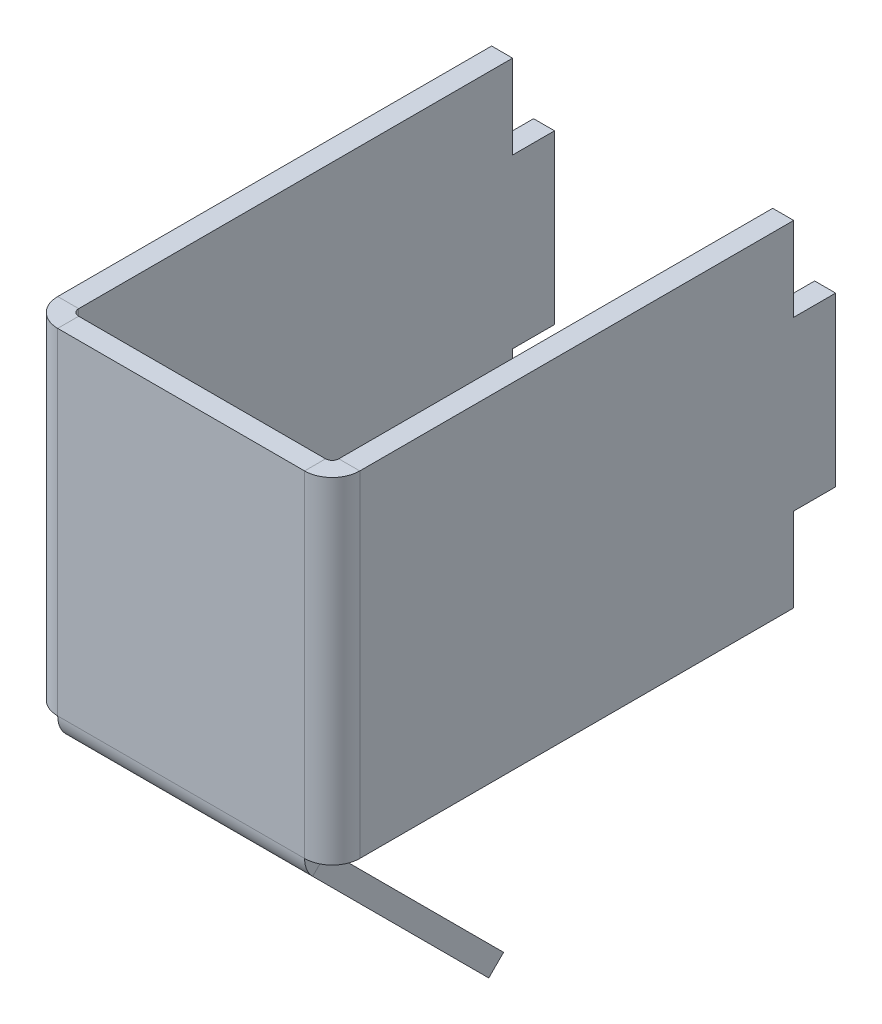
ISO-10303-21;
HEADER;
FILE_DESCRIPTION(('STEP AP214'),'2;1');
FILE_NAME('part.step','',(''),(''),'','','');
FILE_SCHEMA(('AUTOMOTIVE_DESIGN { 1 0 10303 214 1 1 1 1 }'));
ENDSEC;
DATA;
#1=APPLICATION_CONTEXT('core data for automotive mechanical design processes');
#2=APPLICATION_PROTOCOL_DEFINITION('international standard','automotive_design',2000,#1);
#3=PRODUCT_CONTEXT('',#1,'mechanical');
#4=PRODUCT('Part','Part','',(#3));
#5=PRODUCT_RELATED_PRODUCT_CATEGORY('part','',(#4));
#6=PRODUCT_DEFINITION_FORMATION('','',#4);
#7=PRODUCT_DEFINITION_CONTEXT('part definition',#1,'design');
#8=PRODUCT_DEFINITION('design','',#6,#7);
#9=PRODUCT_DEFINITION_SHAPE('','',#8);
#10=(LENGTH_UNIT() NAMED_UNIT(*) SI_UNIT(.MILLI.,.METRE.));
#11=(NAMED_UNIT(*) PLANE_ANGLE_UNIT() SI_UNIT($,.RADIAN.));
#12=(NAMED_UNIT(*) SI_UNIT($,.STERADIAN.) SOLID_ANGLE_UNIT());
#13=UNCERTAINTY_MEASURE_WITH_UNIT(LENGTH_MEASURE(1.E-05),#10,'distance_accuracy_value','');
#14=(GEOMETRIC_REPRESENTATION_CONTEXT(3) GLOBAL_UNCERTAINTY_ASSIGNED_CONTEXT((#13)) GLOBAL_UNIT_ASSIGNED_CONTEXT((#10,
#11,#12)) REPRESENTATION_CONTEXT('',''));
#15=CARTESIAN_POINT('',(0.,0.,0.));
#16=DIRECTION('',(0.,0.,1.));
#17=DIRECTION('',(1.,0.,0.));
#18=AXIS2_PLACEMENT_3D('',#15,#16,#17);
#19=CARTESIAN_POINT('',(18.685,0.,-3.17500000000001));
#20=DIRECTION('',(0.,-1.,0.));
#21=DIRECTION('',(0.,0.,-1.));
#22=AXIS2_PLACEMENT_3D('',#19,#20,#21);
#23=PLANE('',#22);
#24=DIRECTION('',(0.,0.,1.));
#25=VECTOR('',#24,1.);
#26=CARTESIAN_POINT('',(19.685,0.,0.));
#27=LINE('',#26,#25);
#28=CARTESIAN_POINT('',(19.685,0.,-69.85));
#29=VERTEX_POINT('',#28);
#30=CARTESIAN_POINT('',(19.685,0.,-4.17500000000001));
#31=VERTEX_POINT('',#30);
#32=EDGE_CURVE('E366',#29,#31,#27,.T.);
#33=ORIENTED_EDGE('',*,*,#32,.F.);
#34=DIRECTION('',(1.,0.,0.));
#35=VECTOR('',#34,1.);
#36=CARTESIAN_POINT('',(19.685,0.,-69.85));
#37=LINE('',#36,#35);
#38=CARTESIAN_POINT('',(22.86,0.,-69.85));
#39=VERTEX_POINT('',#38);
#40=EDGE_CURVE('E220',#29,#39,#37,.T.);
#41=ORIENTED_EDGE('',*,*,#40,.T.);
#42=DIRECTION('',(0.,0.,1.));
#43=VECTOR('',#42,1.);
#44=CARTESIAN_POINT('',(22.86,0.,0.));
#45=LINE('',#44,#43);
#46=CARTESIAN_POINT('',(22.86,0.,-4.17500000000001));
#47=VERTEX_POINT('',#46);
#48=EDGE_CURVE('E364',#39,#47,#45,.T.);
#49=ORIENTED_EDGE('',*,*,#48,.T.);
#50=DIRECTION('',(-1.,0.,0.));
#51=VECTOR('',#50,1.);
#52=CARTESIAN_POINT('',(22.86,0.,-4.17500000000001));
#53=LINE('',#52,#51);
#54=EDGE_CURVE('E421',#47,#31,#53,.T.);
#55=ORIENTED_EDGE('',*,*,#54,.T.);
#56=EDGE_LOOP('',(#33,#41,#49,#55));
#57=FACE_BOUND('',#56,.T.);
#58=ADVANCED_FACE('F37',(#57),#23,.T.);
#59=CARTESIAN_POINT('',(22.86,50.8,0.));
#60=DIRECTION('',(1.,0.,0.));
#61=DIRECTION('',(0.,0.,-1.));
#62=AXIS2_PLACEMENT_3D('',#59,#60,#61);
#63=PLANE('',#62);
#64=DIRECTION('',(0.,0.,1.));
#65=VECTOR('',#64,1.);
#66=CARTESIAN_POINT('',(22.86,38.1,-76.2));
#67=LINE('',#66,#65);
#68=CARTESIAN_POINT('',(22.86,38.1,-76.2));
#69=VERTEX_POINT('',#68);
#70=CARTESIAN_POINT('',(22.86,38.1,-69.85));
#71=VERTEX_POINT('',#70);
#72=EDGE_CURVE('E216',#69,#71,#67,.T.);
#73=ORIENTED_EDGE('',*,*,#72,.T.);
#74=DIRECTION('',(0.,1.,0.));
#75=VECTOR('',#74,1.);
#76=CARTESIAN_POINT('',(22.86,50.8,-69.85));
#77=LINE('',#76,#75);
#78=CARTESIAN_POINT('',(22.86,50.8,-69.85));
#79=VERTEX_POINT('',#78);
#80=EDGE_CURVE('E209',#71,#79,#77,.T.);
#81=ORIENTED_EDGE('',*,*,#80,.T.);
#82=DIRECTION('',(0.,0.,1.));
#83=VECTOR('',#82,1.);
#84=CARTESIAN_POINT('',(22.86,50.8,0.));
#85=LINE('',#84,#83);
#86=CARTESIAN_POINT('',(22.86,50.8,-4.17500000000001));
#87=VERTEX_POINT('',#86);
#88=EDGE_CURVE('E337',#79,#87,#85,.T.);
#89=ORIENTED_EDGE('',*,*,#88,.T.);
#90=DIRECTION('',(0.,-1.,0.));
#91=VECTOR('',#90,1.);
#92=CARTESIAN_POINT('',(22.86,50.8,-4.17500000000001));
#93=LINE('',#92,#91);
#94=EDGE_CURVE('E392',#87,#47,#93,.T.);
#95=ORIENTED_EDGE('',*,*,#94,.T.);
#96=ORIENTED_EDGE('',*,*,#48,.F.);
#97=DIRECTION('',(0.,1.,0.));
#98=VECTOR('',#97,1.);
#99=CARTESIAN_POINT('',(22.86,0.,-69.85));
#100=LINE('',#99,#98);
#101=CARTESIAN_POINT('',(22.86,12.7,-69.85));
#102=VERTEX_POINT('',#101);
#103=EDGE_CURVE('E229',#39,#102,#100,.T.);
#104=ORIENTED_EDGE('',*,*,#103,.T.);
#105=DIRECTION('',(0.,0.,-1.));
#106=VECTOR('',#105,1.);
#107=CARTESIAN_POINT('',(22.86,12.7,-76.2));
#108=LINE('',#107,#106);
#109=CARTESIAN_POINT('',(22.86,12.7,-76.2));
#110=VERTEX_POINT('',#109);
#111=EDGE_CURVE('E232',#102,#110,#108,.T.);
#112=ORIENTED_EDGE('',*,*,#111,.T.);
#113=DIRECTION('',(0.,-1.,0.));
#114=VECTOR('',#113,1.);
#115=CARTESIAN_POINT('',(22.86,50.8,-76.2));
#116=LINE('',#115,#114);
#117=EDGE_CURVE('E389',#69,#110,#116,.T.);
#118=ORIENTED_EDGE('',*,*,#117,.F.);
#119=EDGE_LOOP('',(#73,#81,#89,#95,#96,#104,#112,#118));
#120=FACE_BOUND('',#119,.T.);
#121=ADVANCED_FACE('F539',(#120),#63,.T.);
#122=CARTESIAN_POINT('',(19.685,50.8,-76.2));
#123=DIRECTION('',(0.,0.,-1.));
#124=DIRECTION('',(-1.,0.,0.));
#125=AXIS2_PLACEMENT_3D('',#122,#123,#124);
#126=PLANE('',#125);
#127=DIRECTION('',(0.,-1.,0.));
#128=VECTOR('',#127,1.);
#129=CARTESIAN_POINT('',(19.685,50.8,-76.2));
#130=LINE('',#129,#128);
#131=CARTESIAN_POINT('',(19.685,38.1,-76.2));
#132=VERTEX_POINT('',#131);
#133=CARTESIAN_POINT('',(19.685,12.7,-76.2));
#134=VERTEX_POINT('',#133);
#135=EDGE_CURVE('E387',#132,#134,#130,.T.);
#136=ORIENTED_EDGE('',*,*,#135,.F.);
#137=DIRECTION('',(1.,0.,0.));
#138=VECTOR('',#137,1.);
#139=CARTESIAN_POINT('',(19.685,38.1,-76.2));
#140=LINE('',#139,#138);
#141=EDGE_CURVE('E202',#132,#69,#140,.T.);
#142=ORIENTED_EDGE('',*,*,#141,.T.);
#143=ORIENTED_EDGE('',*,*,#117,.T.);
#144=DIRECTION('',(1.,0.,0.));
#145=VECTOR('',#144,1.);
#146=CARTESIAN_POINT('',(19.685,12.7,-76.2));
#147=LINE('',#146,#145);
#148=EDGE_CURVE('E231',#134,#110,#147,.T.);
#149=ORIENTED_EDGE('',*,*,#148,.F.);
#150=EDGE_LOOP('',(#136,#142,#143,#149));
#151=FACE_BOUND('',#150,.T.);
#152=ADVANCED_FACE('F545',(#151),#126,.T.);
#153=CARTESIAN_POINT('',(19.685,50.8,0.));
#154=DIRECTION('',(1.,0.,0.));
#155=DIRECTION('',(0.,0.,-1.));
#156=AXIS2_PLACEMENT_3D('',#153,#154,#155);
#157=PLANE('',#156);
#158=DIRECTION('',(0.,1.,0.));
#159=VECTOR('',#158,1.);
#160=CARTESIAN_POINT('',(19.685,50.8,-69.85));
#161=LINE('',#160,#159);
#162=CARTESIAN_POINT('',(19.685,38.1,-69.85));
#163=VERTEX_POINT('',#162);
#164=CARTESIAN_POINT('',(19.685,50.8,-69.85));
#165=VERTEX_POINT('',#164);
#166=EDGE_CURVE('E60',#163,#165,#161,.T.);
#167=ORIENTED_EDGE('',*,*,#166,.F.);
#168=DIRECTION('',(0.,0.,1.));
#169=VECTOR('',#168,1.);
#170=CARTESIAN_POINT('',(19.685,38.1,-76.2));
#171=LINE('',#170,#169);
#172=EDGE_CURVE('E197',#132,#163,#171,.T.);
#173=ORIENTED_EDGE('',*,*,#172,.F.);
#174=ORIENTED_EDGE('',*,*,#135,.T.);
#175=DIRECTION('',(0.,0.,-1.));
#176=VECTOR('',#175,1.);
#177=CARTESIAN_POINT('',(19.685,12.7,-76.2));
#178=LINE('',#177,#176);
#179=CARTESIAN_POINT('',(19.685,12.7,-69.85));
#180=VERTEX_POINT('',#179);
#181=EDGE_CURVE('E226',#180,#134,#178,.T.);
#182=ORIENTED_EDGE('',*,*,#181,.F.);
#183=DIRECTION('',(0.,1.,0.));
#184=VECTOR('',#183,1.);
#185=CARTESIAN_POINT('',(19.685,0.,-69.85));
#186=LINE('',#185,#184);
#187=EDGE_CURVE('E228',#29,#180,#186,.T.);
#188=ORIENTED_EDGE('',*,*,#187,.F.);
#189=ORIENTED_EDGE('',*,*,#32,.T.);
#190=DIRECTION('',(0.,-1.,0.));
#191=VECTOR('',#190,1.);
#192=CARTESIAN_POINT('',(19.685,50.8,-4.17500000000001));
#193=LINE('',#192,#191);
#194=CARTESIAN_POINT('',(19.685,50.8,-4.17500000000001));
#195=VERTEX_POINT('',#194);
#196=EDGE_CURVE('E384',#195,#31,#193,.T.);
#197=ORIENTED_EDGE('',*,*,#196,.F.);
#198=DIRECTION('',(0.,0.,1.));
#199=VECTOR('',#198,1.);
#200=CARTESIAN_POINT('',(19.685,50.8,0.));
#201=LINE('',#200,#199);
#202=EDGE_CURVE('E215',#165,#195,#201,.T.);
#203=ORIENTED_EDGE('',*,*,#202,.F.);
#204=EDGE_LOOP('',(#167,#173,#174,#182,#188,#189,#197,#203));
#205=FACE_BOUND('',#204,.T.);
#206=ADVANCED_FACE('F213',(#205),#157,.F.);
#207=CARTESIAN_POINT('',(-18.685,50.8,-4.175));
#208=DIRECTION('',(0.,1.,0.));
#209=DIRECTION('',(1.,0.,0.));
#210=AXIS2_PLACEMENT_3D('',#207,#208,#209);
#211=PLANE('',#210);
#212=ORIENTED_EDGE('',*,*,#88,.F.);
#213=DIRECTION('',(1.,0.,0.));
#214=VECTOR('',#213,1.);
#215=CARTESIAN_POINT('',(19.685,50.8,-69.85));
#216=LINE('',#215,#214);
#217=EDGE_CURVE('E222',#165,#79,#216,.T.);
#218=ORIENTED_EDGE('',*,*,#217,.F.);
#219=ORIENTED_EDGE('',*,*,#202,.T.);
#220=DIRECTION('',(1.,0.,0.));
#221=VECTOR('',#220,1.);
#222=CARTESIAN_POINT('',(19.685,50.8,-4.17500000000001));
#223=LINE('',#222,#221);
#224=EDGE_CURVE('E45',#195,#87,#223,.T.);
#225=ORIENTED_EDGE('',*,*,#224,.T.);
#226=EDGE_LOOP('',(#212,#218,#219,#225));
#227=FACE_BOUND('',#226,.T.);
#228=ADVANCED_FACE('F428',(#227),#211,.T.);
#229=CARTESIAN_POINT('',(18.685,50.8,0.));
#230=DIRECTION('',(0.,1.,0.));
#231=DIRECTION('',(0.,0.,1.));
#232=AXIS2_PLACEMENT_3D('',#229,#230,#231);
#233=PLANE('',#232);
#234=DIRECTION('',(0.,0.,-1.));
#235=VECTOR('',#234,1.);
#236=CARTESIAN_POINT('',(18.685,50.8,0.));
#237=LINE('',#236,#235);
#238=CARTESIAN_POINT('',(18.685,50.8,0.));
#239=VERTEX_POINT('',#238);
#240=CARTESIAN_POINT('',(18.685,50.8,-3.17500000000001));
#241=VERTEX_POINT('',#240);
#242=EDGE_CURVE('E11',#239,#241,#237,.T.);
#243=ORIENTED_EDGE('',*,*,#242,.F.);
#244=CARTESIAN_POINT('',(18.685,50.8,-4.17500000000001));
#245=DIRECTION('',(0.,1.,0.));
#246=DIRECTION('',(0.,0.,1.));
#247=AXIS2_PLACEMENT_3D('',#244,#245,#246);
#248=CIRCLE('',#247,4.175);
#249=EDGE_CURVE('E334',#87,#239,#248,.F.);
#250=ORIENTED_EDGE('',*,*,#249,.F.);
#251=ORIENTED_EDGE('',*,*,#224,.F.);
#252=CARTESIAN_POINT('',(18.685,50.8,-4.17500000000001));
#253=DIRECTION('',(0.,1.,0.));
#254=DIRECTION('',(1.,0.,0.));
#255=AXIS2_PLACEMENT_3D('',#252,#253,#254);
#256=CIRCLE('',#255,1.);
#257=EDGE_CURVE('E340',#195,#241,#256,.F.);
#258=ORIENTED_EDGE('',*,*,#257,.T.);
#259=EDGE_LOOP('',(#243,#250,#251,#258));
#260=FACE_BOUND('',#259,.T.);
#261=ADVANCED_FACE('F39',(#260),#233,.T.);
#262=CARTESIAN_POINT('',(19.685,50.8,-4.17500000000001));
#263=DIRECTION('',(0.,1.,0.));
#264=DIRECTION('',(0.,0.,1.));
#265=AXIS2_PLACEMENT_3D('',#262,#263,#264);
#266=PLANE('',#265);
#267=DIRECTION('',(-1.,0.,0.));
#268=VECTOR('',#267,1.);
#269=CARTESIAN_POINT('',(-22.86,50.8,0.));
#270=LINE('',#269,#268);
#271=CARTESIAN_POINT('',(-18.685,50.8,0.));
#272=VERTEX_POINT('',#271);
#273=EDGE_CURVE('E331',#239,#272,#270,.T.);
#274=ORIENTED_EDGE('',*,*,#273,.F.);
#275=ORIENTED_EDGE('',*,*,#242,.T.);
#276=DIRECTION('',(-1.,0.,0.));
#277=VECTOR('',#276,1.);
#278=CARTESIAN_POINT('',(-22.86,50.8,-3.175));
#279=LINE('',#278,#277);
#280=CARTESIAN_POINT('',(-18.685,50.8,-3.175));
#281=VERTEX_POINT('',#280);
#282=EDGE_CURVE('E343',#241,#281,#279,.T.);
#283=ORIENTED_EDGE('',*,*,#282,.T.);
#284=DIRECTION('',(0.,0.,1.));
#285=VECTOR('',#284,1.);
#286=CARTESIAN_POINT('',(-18.685,50.8,-3.175));
#287=LINE('',#286,#285);
#288=EDGE_CURVE('E414',#281,#272,#287,.T.);
#289=ORIENTED_EDGE('',*,*,#288,.T.);
#290=EDGE_LOOP('',(#274,#275,#283,#289));
#291=FACE_BOUND('',#290,.T.);
#292=ADVANCED_FACE('F444',(#291),#266,.T.);
#293=CARTESIAN_POINT('',(22.86,0.,-4.17500000000001));
#294=DIRECTION('',(0.,-1.,0.));
#295=DIRECTION('',(0.,0.,-1.));
#296=AXIS2_PLACEMENT_3D('',#293,#294,#295);
#297=PLANE('',#296);
#298=ORIENTED_EDGE('',*,*,#54,.F.);
#299=CARTESIAN_POINT('',(18.685,0.,-4.17500000000001));
#300=DIRECTION('',(0.,1.,0.));
#301=DIRECTION('',(0.,0.,1.));
#302=AXIS2_PLACEMENT_3D('',#299,#300,#301);
#303=CIRCLE('',#302,4.175);
#304=CARTESIAN_POINT('',(18.6849999999999,0.,0.));
#305=VERTEX_POINT('',#304);
#306=EDGE_CURVE('E361',#47,#305,#303,.F.);
#307=ORIENTED_EDGE('',*,*,#306,.T.);
#308=DIRECTION('',(0.,0.,1.));
#309=VECTOR('',#308,1.);
#310=CARTESIAN_POINT('',(18.685,0.,-3.17500000000001));
#311=LINE('',#310,#309);
#312=CARTESIAN_POINT('',(18.685,0.,-3.17500000000001));
#313=VERTEX_POINT('',#312);
#314=EDGE_CURVE('E418',#313,#305,#311,.T.);
#315=ORIENTED_EDGE('',*,*,#314,.F.);
#316=CARTESIAN_POINT('',(18.685,0.,-4.17500000000001));
#317=DIRECTION('',(0.,1.,0.));
#318=DIRECTION('',(1.,0.,0.));
#319=AXIS2_PLACEMENT_3D('',#316,#317,#318);
#320=CIRCLE('',#319,1.);
#321=EDGE_CURVE('E368',#31,#313,#320,.F.);
#322=ORIENTED_EDGE('',*,*,#321,.F.);
#323=EDGE_LOOP('',(#298,#307,#315,#322));
#324=FACE_BOUND('',#323,.T.);
#325=ADVANCED_FACE('F509',(#324),#297,.T.);
#326=CARTESIAN_POINT('',(-22.86,50.8,-4.175));
#327=DIRECTION('',(0.,1.,0.));
#328=DIRECTION('',(0.,0.,1.));
#329=AXIS2_PLACEMENT_3D('',#326,#327,#328);
#330=PLANE('',#329);
#331=DIRECTION('',(1.,0.,0.));
#332=VECTOR('',#331,1.);
#333=CARTESIAN_POINT('',(-22.86,50.8,-4.175));
#334=LINE('',#333,#332);
#335=CARTESIAN_POINT('',(-22.86,50.8,-4.175));
#336=VERTEX_POINT('',#335);
#337=CARTESIAN_POINT('',(-19.685,50.8,-4.175));
#338=VERTEX_POINT('',#337);
#339=EDGE_CURVE('E416',#336,#338,#334,.T.);
#340=ORIENTED_EDGE('',*,*,#339,.F.);
#341=CARTESIAN_POINT('',(-18.685,50.8,-4.175));
#342=DIRECTION('',(0.,1.,0.));
#343=DIRECTION('',(0.,0.,1.));
#344=AXIS2_PLACEMENT_3D('',#341,#342,#343);
#345=CIRCLE('',#344,4.175);
#346=EDGE_CURVE('E328',#272,#336,#345,.F.);
#347=ORIENTED_EDGE('',*,*,#346,.F.);
#348=ORIENTED_EDGE('',*,*,#288,.F.);
#349=CARTESIAN_POINT('',(-18.685,50.8,-4.175));
#350=DIRECTION('',(0.,1.,0.));
#351=DIRECTION('',(1.,0.,0.));
#352=AXIS2_PLACEMENT_3D('',#349,#350,#351);
#353=CIRCLE('',#352,1.);
#354=EDGE_CURVE('E346',#281,#338,#353,.F.);
#355=ORIENTED_EDGE('',*,*,#354,.T.);
#356=EDGE_LOOP('',(#340,#347,#348,#355));
#357=FACE_BOUND('',#356,.T.);
#358=ADVANCED_FACE('F453',(#357),#330,.T.);
#359=CARTESIAN_POINT('',(-18.685,50.8,-3.175));
#360=DIRECTION('',(0.,1.,0.));
#361=DIRECTION('',(0.,0.,1.));
#362=AXIS2_PLACEMENT_3D('',#359,#360,#361);
#363=PLANE('',#362);
#364=DIRECTION('',(-1.,0.,0.));
#365=VECTOR('',#364,1.);
#366=CARTESIAN_POINT('',(-19.685,50.8,-69.85));
#367=LINE('',#366,#365);
#368=CARTESIAN_POINT('',(-19.685,50.8,-69.85));
#369=VERTEX_POINT('',#368);
#370=CARTESIAN_POINT('',(-22.86,50.8,-69.85));
#371=VERTEX_POINT('',#370);
#372=EDGE_CURVE('E248',#369,#371,#367,.T.);
#373=ORIENTED_EDGE('',*,*,#372,.T.);
#374=DIRECTION('',(0.,0.,-1.));
#375=VECTOR('',#374,1.);
#376=CARTESIAN_POINT('',(-22.86,50.8,0.));
#377=LINE('',#376,#375);
#378=EDGE_CURVE('E324',#336,#371,#377,.T.);
#379=ORIENTED_EDGE('',*,*,#378,.F.);
#380=ORIENTED_EDGE('',*,*,#339,.T.);
#381=DIRECTION('',(0.,0.,-1.));
#382=VECTOR('',#381,1.);
#383=CARTESIAN_POINT('',(-19.685,50.8,0.));
#384=LINE('',#383,#382);
#385=EDGE_CURVE('E321',#338,#369,#384,.T.);
#386=ORIENTED_EDGE('',*,*,#385,.T.);
#387=EDGE_LOOP('',(#373,#379,#380,#386));
#388=FACE_BOUND('',#387,.T.);
#389=ADVANCED_FACE('F464',(#388),#363,.T.);
#390=CARTESIAN_POINT('',(-18.685,0.,0.));
#391=DIRECTION('',(0.,-1.,0.));
#392=DIRECTION('',(0.,0.,-1.));
#393=AXIS2_PLACEMENT_3D('',#390,#391,#392);
#394=PLANE('',#393);
#395=DIRECTION('',(0.,0.,-1.));
#396=VECTOR('',#395,1.);
#397=CARTESIAN_POINT('',(-18.685,0.,0.));
#398=LINE('',#397,#396);
#399=CARTESIAN_POINT('',(-18.6850000000001,0.,0.));
#400=VERTEX_POINT('',#399);
#401=CARTESIAN_POINT('',(-18.685,0.,-3.175));
#402=VERTEX_POINT('',#401);
#403=EDGE_CURVE('E412',#400,#402,#398,.T.);
#404=ORIENTED_EDGE('',*,*,#403,.F.);
#405=CARTESIAN_POINT('',(-18.685,0.,-4.175));
#406=DIRECTION('',(0.,1.,0.));
#407=DIRECTION('',(0.,0.,1.));
#408=AXIS2_PLACEMENT_3D('',#405,#406,#407);
#409=CIRCLE('',#408,4.175);
#410=CARTESIAN_POINT('',(-22.86,0.,-4.175));
#411=VERTEX_POINT('',#410);
#412=EDGE_CURVE('E355',#400,#411,#409,.F.);
#413=ORIENTED_EDGE('',*,*,#412,.T.);
#414=DIRECTION('',(-1.,0.,0.));
#415=VECTOR('',#414,1.);
#416=CARTESIAN_POINT('',(-19.685,0.,-4.175));
#417=LINE('',#416,#415);
#418=CARTESIAN_POINT('',(-19.685,0.,-4.175));
#419=VERTEX_POINT('',#418);
#420=EDGE_CURVE('E410',#419,#411,#417,.T.);
#421=ORIENTED_EDGE('',*,*,#420,.F.);
#422=CARTESIAN_POINT('',(-18.685,0.,-4.175));
#423=DIRECTION('',(0.,1.,0.));
#424=DIRECTION('',(1.,0.,0.));
#425=AXIS2_PLACEMENT_3D('',#422,#423,#424);
#426=CIRCLE('',#425,1.);
#427=EDGE_CURVE('E325',#402,#419,#426,.F.);
#428=ORIENTED_EDGE('',*,*,#427,.F.);
#429=EDGE_LOOP('',(#404,#413,#421,#428));
#430=FACE_BOUND('',#429,.T.);
#431=ADVANCED_FACE('F494',(#430),#394,.T.);
#432=CARTESIAN_POINT('',(-19.685,50.8,0.));
#433=DIRECTION('',(-1.,0.,0.));
#434=DIRECTION('',(0.,0.,1.));
#435=AXIS2_PLACEMENT_3D('',#432,#433,#434);
#436=PLANE('',#435);
#437=DIRECTION('',(0.,0.,1.));
#438=VECTOR('',#437,1.);
#439=CARTESIAN_POINT('',(-19.685,38.1,-76.2));
#440=LINE('',#439,#438);
#441=CARTESIAN_POINT('',(-19.685,38.1,-76.2));
#442=VERTEX_POINT('',#441);
#443=CARTESIAN_POINT('',(-19.685,38.1,-69.85));
#444=VERTEX_POINT('',#443);
#445=EDGE_CURVE('E244',#442,#444,#440,.T.);
#446=ORIENTED_EDGE('',*,*,#445,.T.);
#447=DIRECTION('',(0.,1.,0.));
#448=VECTOR('',#447,1.);
#449=CARTESIAN_POINT('',(-19.685,50.8,-69.85));
#450=LINE('',#449,#448);
#451=EDGE_CURVE('E241',#444,#369,#450,.T.);
#452=ORIENTED_EDGE('',*,*,#451,.T.);
#453=ORIENTED_EDGE('',*,*,#385,.F.);
#454=DIRECTION('',(0.,-1.,0.));
#455=VECTOR('',#454,1.);
#456=CARTESIAN_POINT('',(-19.685,50.8,-4.175));
#457=LINE('',#456,#455);
#458=EDGE_CURVE('E349',#338,#419,#457,.T.);
#459=ORIENTED_EDGE('',*,*,#458,.T.);
#460=DIRECTION('',(0.,0.,-1.));
#461=VECTOR('',#460,1.);
#462=CARTESIAN_POINT('',(-19.685,0.,0.));
#463=LINE('',#462,#461);
#464=CARTESIAN_POINT('',(-19.685,0.,-69.85));
#465=VERTEX_POINT('',#464);
#466=EDGE_CURVE('E318',#419,#465,#463,.T.);
#467=ORIENTED_EDGE('',*,*,#466,.T.);
#468=DIRECTION('',(0.,1.,0.));
#469=VECTOR('',#468,1.);
#470=CARTESIAN_POINT('',(-19.685,0.,-69.85));
#471=LINE('',#470,#469);
#472=CARTESIAN_POINT('',(-19.685,12.7,-69.85));
#473=VERTEX_POINT('',#472);
#474=EDGE_CURVE('E261',#465,#473,#471,.T.);
#475=ORIENTED_EDGE('',*,*,#474,.T.);
#476=DIRECTION('',(0.,0.,-1.));
#477=VECTOR('',#476,1.);
#478=CARTESIAN_POINT('',(-19.685,12.7,-76.2));
#479=LINE('',#478,#477);
#480=CARTESIAN_POINT('',(-19.685,12.7,-76.2));
#481=VERTEX_POINT('',#480);
#482=EDGE_CURVE('E264',#473,#481,#479,.T.);
#483=ORIENTED_EDGE('',*,*,#482,.T.);
#484=DIRECTION('',(0.,-1.,0.));
#485=VECTOR('',#484,1.);
#486=CARTESIAN_POINT('',(-19.685,50.8,-76.2));
#487=LINE('',#486,#485);
#488=EDGE_CURVE('E407',#442,#481,#487,.T.);
#489=ORIENTED_EDGE('',*,*,#488,.F.);
#490=EDGE_LOOP('',(#446,#452,#453,#459,#467,#475,#483,#489));
#491=FACE_BOUND('',#490,.T.);
#492=ADVANCED_FACE('F470',(#491),#436,.F.);
#493=CARTESIAN_POINT('',(-22.86,50.8,-76.2));
#494=DIRECTION('',(0.,0.,-1.));
#495=DIRECTION('',(-1.,0.,0.));
#496=AXIS2_PLACEMENT_3D('',#493,#494,#495);
#497=PLANE('',#496);
#498=DIRECTION('',(-1.,0.,0.));
#499=VECTOR('',#498,1.);
#500=CARTESIAN_POINT('',(-19.685,38.1,-76.2));
#501=LINE('',#500,#499);
#502=CARTESIAN_POINT('',(-22.86,38.1,-76.2));
#503=VERTEX_POINT('',#502);
#504=EDGE_CURVE('E257',#442,#503,#501,.T.);
#505=ORIENTED_EDGE('',*,*,#504,.F.);
#506=ORIENTED_EDGE('',*,*,#488,.T.);
#507=DIRECTION('',(-1.,0.,0.));
#508=VECTOR('',#507,1.);
#509=CARTESIAN_POINT('',(-19.685,12.7,-76.2));
#510=LINE('',#509,#508);
#511=CARTESIAN_POINT('',(-22.86,12.7,-76.2));
#512=VERTEX_POINT('',#511);
#513=EDGE_CURVE('E251',#481,#512,#510,.T.);
#514=ORIENTED_EDGE('',*,*,#513,.T.);
#515=DIRECTION('',(0.,-1.,0.));
#516=VECTOR('',#515,1.);
#517=CARTESIAN_POINT('',(-22.86,50.8,-76.2));
#518=LINE('',#517,#516);
#519=EDGE_CURVE('E404',#503,#512,#518,.T.);
#520=ORIENTED_EDGE('',*,*,#519,.F.);
#521=EDGE_LOOP('',(#505,#506,#514,#520));
#522=FACE_BOUND('',#521,.T.);
#523=ADVANCED_FACE('F478',(#522),#497,.T.);
#524=CARTESIAN_POINT('',(-22.86,50.8,0.));
#525=DIRECTION('',(-1.,0.,0.));
#526=DIRECTION('',(0.,0.,1.));
#527=AXIS2_PLACEMENT_3D('',#524,#525,#526);
#528=PLANE('',#527);
#529=DIRECTION('',(0.,1.,0.));
#530=VECTOR('',#529,1.);
#531=CARTESIAN_POINT('',(-22.86,50.8,-69.85));
#532=LINE('',#531,#530);
#533=CARTESIAN_POINT('',(-22.86,38.1,-69.85));
#534=VERTEX_POINT('',#533);
#535=EDGE_CURVE('E249',#534,#371,#532,.T.);
#536=ORIENTED_EDGE('',*,*,#535,.F.);
#537=DIRECTION('',(0.,0.,1.));
#538=VECTOR('',#537,1.);
#539=CARTESIAN_POINT('',(-22.86,38.1,-76.2));
#540=LINE('',#539,#538);
#541=EDGE_CURVE('E245',#503,#534,#540,.T.);
#542=ORIENTED_EDGE('',*,*,#541,.F.);
#543=ORIENTED_EDGE('',*,*,#519,.T.);
#544=DIRECTION('',(0.,0.,-1.));
#545=VECTOR('',#544,1.);
#546=CARTESIAN_POINT('',(-22.86,12.7,-76.2));
#547=LINE('',#546,#545);
#548=CARTESIAN_POINT('',(-22.86,12.7,-69.85));
#549=VERTEX_POINT('',#548);
#550=EDGE_CURVE('E265',#549,#512,#547,.T.);
#551=ORIENTED_EDGE('',*,*,#550,.F.);
#552=DIRECTION('',(0.,1.,0.));
#553=VECTOR('',#552,1.);
#554=CARTESIAN_POINT('',(-22.86,0.,-69.85));
#555=LINE('',#554,#553);
#556=CARTESIAN_POINT('',(-22.86,0.,-69.85));
#557=VERTEX_POINT('',#556);
#558=EDGE_CURVE('E224',#557,#549,#555,.T.);
#559=ORIENTED_EDGE('',*,*,#558,.F.);
#560=DIRECTION('',(0.,0.,-1.));
#561=VECTOR('',#560,1.);
#562=CARTESIAN_POINT('',(-22.86,0.,0.));
#563=LINE('',#562,#561);
#564=EDGE_CURVE('E352',#411,#557,#563,.T.);
#565=ORIENTED_EDGE('',*,*,#564,.F.);
#566=DIRECTION('',(0.,-1.,0.));
#567=VECTOR('',#566,1.);
#568=CARTESIAN_POINT('',(-22.86,50.8,-4.175));
#569=LINE('',#568,#567);
#570=EDGE_CURVE('E401',#336,#411,#569,.T.);
#571=ORIENTED_EDGE('',*,*,#570,.F.);
#572=ORIENTED_EDGE('',*,*,#378,.T.);
#573=EDGE_LOOP('',(#536,#542,#543,#551,#559,#565,#571,#572));
#574=FACE_BOUND('',#573,.T.);
#575=ADVANCED_FACE('F462',(#574),#528,.T.);
#576=CARTESIAN_POINT('',(-18.685,50.8,-4.175));
#577=DIRECTION('',(0.,-1.,0.));
#578=DIRECTION('',(0.,0.,-1.));
#579=AXIS2_PLACEMENT_3D('',#576,#577,#578);
#580=CYLINDRICAL_SURFACE('',#579,4.175);
#581=ORIENTED_EDGE('',*,*,#412,.F.);
#582=DIRECTION('',(0.,-1.,0.));
#583=VECTOR('',#582,1.);
#584=CARTESIAN_POINT('',(-18.685,50.8,0.));
#585=LINE('',#584,#583);
#586=EDGE_CURVE('E398',#272,#400,#585,.T.);
#587=ORIENTED_EDGE('',*,*,#586,.F.);
#588=ORIENTED_EDGE('',*,*,#346,.T.);
#589=ORIENTED_EDGE('',*,*,#570,.T.);
#590=EDGE_LOOP('',(#581,#587,#588,#589));
#591=FACE_BOUND('',#590,.T.);
#592=ADVANCED_FACE('F452',(#591),#580,.T.);
#593=CARTESIAN_POINT('',(-22.86,50.8,0.));
#594=DIRECTION('',(0.,0.,1.));
#595=DIRECTION('',(1.,0.,0.));
#596=AXIS2_PLACEMENT_3D('',#593,#594,#595);
#597=PLANE('',#596);
#598=DIRECTION('',(-1.,0.,0.));
#599=VECTOR('',#598,1.);
#600=CARTESIAN_POINT('',(-22.86,0.,0.));
#601=LINE('',#600,#599);
#602=EDGE_CURVE('E358',#305,#400,#601,.T.);
#603=ORIENTED_EDGE('',*,*,#602,.F.);
#604=DIRECTION('',(0.,-1.,0.));
#605=VECTOR('',#604,1.);
#606=CARTESIAN_POINT('',(18.685,50.8,0.));
#607=LINE('',#606,#605);
#608=EDGE_CURVE('E395',#239,#305,#607,.T.);
#609=ORIENTED_EDGE('',*,*,#608,.F.);
#610=ORIENTED_EDGE('',*,*,#273,.T.);
#611=ORIENTED_EDGE('',*,*,#586,.T.);
#612=EDGE_LOOP('',(#603,#609,#610,#611));
#613=FACE_BOUND('',#612,.T.);
#614=ADVANCED_FACE('F443',(#613),#597,.T.);
#615=CARTESIAN_POINT('',(18.685,50.8,-4.17500000000001));
#616=DIRECTION('',(0.,-1.,0.));
#617=DIRECTION('',(0.,0.,-1.));
#618=AXIS2_PLACEMENT_3D('',#615,#616,#617);
#619=CYLINDRICAL_SURFACE('',#618,4.175);
#620=ORIENTED_EDGE('',*,*,#306,.F.);
#621=ORIENTED_EDGE('',*,*,#94,.F.);
#622=ORIENTED_EDGE('',*,*,#249,.T.);
#623=ORIENTED_EDGE('',*,*,#608,.T.);
#624=EDGE_LOOP('',(#620,#621,#622,#623));
#625=FACE_BOUND('',#624,.T.);
#626=ADVANCED_FACE('F433',(#625),#619,.T.);
#627=CARTESIAN_POINT('',(18.685,50.8,-4.17500000000001));
#628=DIRECTION('',(0.,-1.,0.));
#629=DIRECTION('',(0.,0.,-1.));
#630=AXIS2_PLACEMENT_3D('',#627,#628,#629);
#631=CYLINDRICAL_SURFACE('',#630,1.);
#632=ORIENTED_EDGE('',*,*,#321,.T.);
#633=DIRECTION('',(0.,-1.,0.));
#634=VECTOR('',#633,1.);
#635=CARTESIAN_POINT('',(18.685,50.8,-3.17500000000001));
#636=LINE('',#635,#634);
#637=EDGE_CURVE('E381',#241,#313,#636,.T.);
#638=ORIENTED_EDGE('',*,*,#637,.F.);
#639=ORIENTED_EDGE('',*,*,#257,.F.);
#640=ORIENTED_EDGE('',*,*,#196,.T.);
#641=EDGE_LOOP('',(#632,#638,#639,#640));
#642=FACE_BOUND('',#641,.T.);
#643=ADVANCED_FACE('F505',(#642),#631,.F.);
#644=CARTESIAN_POINT('',(-22.86,50.8,-3.175));
#645=DIRECTION('',(0.,0.,1.));
#646=DIRECTION('',(1.,0.,0.));
#647=AXIS2_PLACEMENT_3D('',#644,#645,#646);
#648=PLANE('',#647);
#649=DIRECTION('',(-1.,0.,0.));
#650=VECTOR('',#649,1.);
#651=CARTESIAN_POINT('',(-22.86,0.,-3.175));
#652=LINE('',#651,#650);
#653=EDGE_CURVE('E371',#313,#402,#652,.T.);
#654=ORIENTED_EDGE('',*,*,#653,.T.);
#655=DIRECTION('',(0.,-1.,0.));
#656=VECTOR('',#655,1.);
#657=CARTESIAN_POINT('',(-18.685,50.8,-3.175));
#658=LINE('',#657,#656);
#659=EDGE_CURVE('E378',#281,#402,#658,.T.);
#660=ORIENTED_EDGE('',*,*,#659,.F.);
#661=ORIENTED_EDGE('',*,*,#282,.F.);
#662=ORIENTED_EDGE('',*,*,#637,.T.);
#663=EDGE_LOOP('',(#654,#660,#661,#662));
#664=FACE_BOUND('',#663,.T.);
#665=ADVANCED_FACE('F503',(#664),#648,.F.);
#666=CARTESIAN_POINT('',(-18.685,50.8,-4.175));
#667=DIRECTION('',(0.,-1.,0.));
#668=DIRECTION('',(0.,0.,-1.));
#669=AXIS2_PLACEMENT_3D('',#666,#667,#668);
#670=CYLINDRICAL_SURFACE('',#669,1.);
#671=ORIENTED_EDGE('',*,*,#427,.T.);
#672=ORIENTED_EDGE('',*,*,#458,.F.);
#673=ORIENTED_EDGE('',*,*,#354,.F.);
#674=ORIENTED_EDGE('',*,*,#659,.T.);
#675=EDGE_LOOP('',(#671,#672,#673,#674));
#676=FACE_BOUND('',#675,.T.);
#677=ADVANCED_FACE('F490',(#676),#670,.F.);
#678=CARTESIAN_POINT('',(-18.685,0.,-4.175));
#679=DIRECTION('',(0.,1.,0.));
#680=DIRECTION('',(1.,0.,0.));
#681=AXIS2_PLACEMENT_3D('',#678,#679,#680);
#682=PLANE('',#681);
#683=ORIENTED_EDGE('',*,*,#564,.T.);
#684=DIRECTION('',(-1.,0.,0.));
#685=VECTOR('',#684,1.);
#686=CARTESIAN_POINT('',(-19.685,0.,-69.85));
#687=LINE('',#686,#685);
#688=EDGE_CURVE('E268',#465,#557,#687,.T.);
#689=ORIENTED_EDGE('',*,*,#688,.F.);
#690=ORIENTED_EDGE('',*,*,#466,.F.);
#691=ORIENTED_EDGE('',*,*,#420,.T.);
#692=EDGE_LOOP('',(#683,#689,#690,#691));
#693=FACE_BOUND('',#692,.T.);
#694=ADVANCED_FACE('F488',(#693),#682,.F.);
#695=CARTESIAN_POINT('',(-18.685,-27.3549819255806,-30.1157683632074));
#696=DIRECTION('',(0.,0.707106781186549,0.707106781186546));
#697=DIRECTION('',(1.,0.,0.));
#698=AXIS2_PLACEMENT_3D('',#695,#696,#697);
#699=PLANE('',#698);
#700=DIRECTION('',(0.,0.707106781186546,-0.707106781186549));
#701=VECTOR('',#700,1.);
#702=CARTESIAN_POINT('',(18.685,-27.3549819255806,-30.1157683632074));
#703=LINE('',#702,#701);
#704=CARTESIAN_POINT('',(18.685,-27.3549819255806,-30.1157683632074));
#705=VERTEX_POINT('',#704);
#706=CARTESIAN_POINT('',(18.685,-29.6000459558479,-27.8707043329401));
#707=VERTEX_POINT('',#706);
#708=EDGE_CURVE('E315',#705,#707,#703,.F.);
#709=ORIENTED_EDGE('',*,*,#708,.T.);
#710=DIRECTION('',(1.,0.,0.));
#711=VECTOR('',#710,1.);
#712=CARTESIAN_POINT('',(-18.685,-29.6000459558479,-27.8707043329401));
#713=LINE('',#712,#711);
#714=CARTESIAN_POINT('',(-18.685,-29.6000459558479,-27.8707043329401));
#715=VERTEX_POINT('',#714);
#716=EDGE_CURVE('E294',#715,#707,#713,.T.);
#717=ORIENTED_EDGE('',*,*,#716,.F.);
#718=DIRECTION('',(0.,0.707106781186546,-0.707106781186549));
#719=VECTOR('',#718,1.);
#720=CARTESIAN_POINT('',(-18.685,-27.3549819255806,-30.1157683632074));
#721=LINE('',#720,#719);
#722=CARTESIAN_POINT('',(-18.685,-27.3549819255806,-30.1157683632074));
#723=VERTEX_POINT('',#722);
#724=EDGE_CURVE('E312',#723,#715,#721,.F.);
#725=ORIENTED_EDGE('',*,*,#724,.F.);
#726=DIRECTION('',(1.,0.,0.));
#727=VECTOR('',#726,1.);
#728=CARTESIAN_POINT('',(-18.685,-27.3549819255806,-30.1157683632074));
#729=LINE('',#728,#727);
#730=EDGE_CURVE('E283',#723,#705,#729,.T.);
#731=ORIENTED_EDGE('',*,*,#730,.T.);
#732=EDGE_LOOP('',(#709,#717,#725,#731));
#733=FACE_BOUND('',#732,.T.);
#734=ADVANCED_FACE('F569',(#733),#699,.F.);
#735=CARTESIAN_POINT('',(-18.685,-27.3549819255806,-30.1157683632074));
#736=DIRECTION('',(-1.,0.,0.));
#737=DIRECTION('',(0.,0.707106781186549,0.707106781186546));
#738=AXIS2_PLACEMENT_3D('',#735,#736,#737);
#739=PLANE('',#738);
#740=ORIENTED_EDGE('',*,*,#724,.T.);
#741=DIRECTION('',(0.,0.707106781186549,0.707106781186546));
#742=VECTOR('',#741,1.);
#743=CARTESIAN_POINT('',(-18.685,-29.6000459558479,-27.8707043329401));
#744=LINE('',#743,#742);
#745=CARTESIAN_POINT('',(-18.6850000000001,-2.95217081145379,-1.22282918854612));
#746=VERTEX_POINT('',#745);
#747=EDGE_CURVE('E291',#715,#746,#744,.T.);
#748=ORIENTED_EDGE('',*,*,#747,.T.);
#749=DIRECTION('',(0.,0.707106781186546,-0.707106781186549));
#750=VECTOR('',#749,1.);
#751=CARTESIAN_POINT('',(-18.685,-0.707106781186537,-3.46789321881344));
#752=LINE('',#751,#750);
#753=CARTESIAN_POINT('',(-18.6850000000001,-0.707106781186537,-3.46789321881344));
#754=VERTEX_POINT('',#753);
#755=EDGE_CURVE('E309',#754,#746,#752,.F.);
#756=ORIENTED_EDGE('',*,*,#755,.F.);
#757=DIRECTION('',(0.,0.707106781186549,0.707106781186546));
#758=VECTOR('',#757,1.);
#759=CARTESIAN_POINT('',(-18.685,-27.3549819255806,-30.1157683632074));
#760=LINE('',#759,#758);
#761=EDGE_CURVE('E300',#723,#754,#760,.T.);
#762=ORIENTED_EDGE('',*,*,#761,.F.);
#763=EDGE_LOOP('',(#740,#748,#756,#762));
#764=FACE_BOUND('',#763,.T.);
#765=ADVANCED_FACE('F523',(#764),#739,.T.);
#766=CARTESIAN_POINT('',(18.685,-27.3549819255806,-30.1157683632074));
#767=DIRECTION('',(1.,0.,0.));
#768=DIRECTION('',(0.,-0.707106781186549,-0.707106781186546));
#769=AXIS2_PLACEMENT_3D('',#766,#767,#768);
#770=PLANE('',#769);
#771=DIRECTION('',(0.,-0.707106781186549,-0.707106781186546));
#772=VECTOR('',#771,1.);
#773=CARTESIAN_POINT('',(18.685,-27.3549819255806,-30.1157683632074));
#774=LINE('',#773,#772);
#775=CARTESIAN_POINT('',(18.685,-0.707106781186537,-3.46789321881345));
#776=VERTEX_POINT('',#775);
#777=EDGE_CURVE('E297',#776,#705,#774,.T.);
#778=ORIENTED_EDGE('',*,*,#777,.F.);
#779=DIRECTION('',(0.,0.707106781186546,-0.707106781186549));
#780=VECTOR('',#779,1.);
#781=CARTESIAN_POINT('',(18.685,-0.707106781186537,-3.46789321881345));
#782=LINE('',#781,#780);
#783=CARTESIAN_POINT('',(18.6849999999999,-2.95217081145379,-1.22282918854613));
#784=VERTEX_POINT('',#783);
#785=EDGE_CURVE('E299',#776,#784,#782,.F.);
#786=ORIENTED_EDGE('',*,*,#785,.T.);
#787=DIRECTION('',(0.,0.707106781186549,0.707106781186546));
#788=VECTOR('',#787,1.);
#789=CARTESIAN_POINT('',(18.685,-29.6000459558479,-27.8707043329401));
#790=LINE('',#789,#788);
#791=EDGE_CURVE('E290',#784,#707,#790,.F.);
#792=ORIENTED_EDGE('',*,*,#791,.T.);
#793=ORIENTED_EDGE('',*,*,#708,.F.);
#794=EDGE_LOOP('',(#778,#786,#792,#793));
#795=FACE_BOUND('',#794,.T.);
#796=ADVANCED_FACE('F516',(#795),#770,.T.);
#797=CARTESIAN_POINT('',(-18.685,-29.6000459558479,-27.8707043329401));
#798=DIRECTION('',(0.,0.707106781186546,-0.707106781186549));
#799=DIRECTION('',(0.,0.707106781186549,0.707106781186546));
#800=AXIS2_PLACEMENT_3D('',#797,#798,#799);
#801=PLANE('',#800);
#802=DIRECTION('',(1.,0.,0.));
#803=VECTOR('',#802,1.);
#804=CARTESIAN_POINT('',(-18.685,-2.95217081145382,-1.22282918854615));
#805=LINE('',#804,#803);
#806=EDGE_CURVE('E288',#746,#784,#805,.T.);
#807=ORIENTED_EDGE('',*,*,#806,.F.);
#808=ORIENTED_EDGE('',*,*,#747,.F.);
#809=ORIENTED_EDGE('',*,*,#716,.T.);
#810=ORIENTED_EDGE('',*,*,#791,.F.);
#811=EDGE_LOOP('',(#807,#808,#809,#810));
#812=FACE_BOUND('',#811,.T.);
#813=ADVANCED_FACE('F526',(#812),#801,.F.);
#814=CARTESIAN_POINT('',(-18.685,-27.3549819255806,-30.1157683632074));
#815=DIRECTION('',(0.,0.707106781186546,-0.707106781186549));
#816=DIRECTION('',(0.,0.707106781186549,0.707106781186546));
#817=AXIS2_PLACEMENT_3D('',#814,#815,#816);
#818=PLANE('',#817);
#819=DIRECTION('',(1.,0.,0.));
#820=VECTOR('',#819,1.);
#821=CARTESIAN_POINT('',(-18.685,-0.707106781186537,-3.46789321881344));
#822=LINE('',#821,#820);
#823=EDGE_CURVE('E303',#754,#776,#822,.T.);
#824=ORIENTED_EDGE('',*,*,#823,.T.);
#825=ORIENTED_EDGE('',*,*,#777,.T.);
#826=ORIENTED_EDGE('',*,*,#730,.F.);
#827=ORIENTED_EDGE('',*,*,#761,.T.);
#828=EDGE_LOOP('',(#824,#825,#826,#827));
#829=FACE_BOUND('',#828,.T.);
#830=ADVANCED_FACE('F519',(#829),#818,.T.);
#831=CARTESIAN_POINT('',(18.685,0.,-4.175));
#832=DIRECTION('',(-1.,0.,0.));
#833=DIRECTION('',(0.,0.,1.));
#834=AXIS2_PLACEMENT_3D('',#831,#832,#833);
#835=PLANE('',#834);
#836=ORIENTED_EDGE('',*,*,#314,.T.);
#837=CARTESIAN_POINT('',(18.6849999999999,0.,-4.175));
#838=DIRECTION('',(1.,0.,0.));
#839=DIRECTION('',(0.,0.,-1.));
#840=AXIS2_PLACEMENT_3D('',#837,#838,#839);
#841=CIRCLE('',#840,4.175);
#842=EDGE_CURVE('E277',#305,#784,#841,.T.);
#843=ORIENTED_EDGE('',*,*,#842,.T.);
#844=ORIENTED_EDGE('',*,*,#785,.F.);
#845=CARTESIAN_POINT('',(18.685,0.,-4.175));
#846=DIRECTION('',(1.,0.,0.));
#847=DIRECTION('',(0.,0.,-1.));
#848=AXIS2_PLACEMENT_3D('',#845,#846,#847);
#849=CIRCLE('',#848,1.);
#850=EDGE_CURVE('E256',#313,#776,#849,.T.);
#851=ORIENTED_EDGE('',*,*,#850,.F.);
#852=EDGE_LOOP('',(#836,#843,#844,#851));
#853=FACE_BOUND('',#852,.T.);
#854=ADVANCED_FACE('F511',(#853),#835,.F.);
#855=CARTESIAN_POINT('',(-18.685,0.,-4.175));
#856=DIRECTION('',(1.,0.,0.));
#857=DIRECTION('',(0.,0.,-1.));
#858=AXIS2_PLACEMENT_3D('',#855,#856,#857);
#859=PLANE('',#858);
#860=CARTESIAN_POINT('',(-18.685,0.,-4.175));
#861=DIRECTION('',(-1.,0.,0.));
#862=DIRECTION('',(0.,0.,1.));
#863=AXIS2_PLACEMENT_3D('',#860,#861,#862);
#864=CIRCLE('',#863,1.);
#865=EDGE_CURVE('E281',#754,#402,#864,.T.);
#866=ORIENTED_EDGE('',*,*,#865,.F.);
#867=ORIENTED_EDGE('',*,*,#755,.T.);
#868=CARTESIAN_POINT('',(-18.6850000000001,0.,-4.175));
#869=DIRECTION('',(1.,0.,0.));
#870=DIRECTION('',(0.,0.,-1.));
#871=AXIS2_PLACEMENT_3D('',#868,#869,#870);
#872=CIRCLE('',#871,4.175);
#873=EDGE_CURVE('E280',#746,#400,#872,.F.);
#874=ORIENTED_EDGE('',*,*,#873,.T.);
#875=ORIENTED_EDGE('',*,*,#403,.T.);
#876=EDGE_LOOP('',(#866,#867,#874,#875));
#877=FACE_BOUND('',#876,.T.);
#878=ADVANCED_FACE('F496',(#877),#859,.F.);
#879=CARTESIAN_POINT('',(-205.535,0.,-4.17499999999996));
#880=DIRECTION('',(1.,0.,0.));
#881=DIRECTION('',(0.,0.,-1.));
#882=AXIS2_PLACEMENT_3D('',#879,#880,#881);
#883=CYLINDRICAL_SURFACE('',#882,4.175);
#884=ORIENTED_EDGE('',*,*,#806,.T.);
#885=ORIENTED_EDGE('',*,*,#842,.F.);
#886=ORIENTED_EDGE('',*,*,#602,.T.);
#887=ORIENTED_EDGE('',*,*,#873,.F.);
#888=EDGE_LOOP('',(#884,#885,#886,#887));
#889=FACE_BOUND('',#888,.T.);
#890=ADVANCED_FACE('F528',(#889),#883,.T.);
#891=CARTESIAN_POINT('',(-205.535,0.,-4.17499999999996));
#892=DIRECTION('',(1.,0.,0.));
#893=DIRECTION('',(0.,0.,-1.));
#894=AXIS2_PLACEMENT_3D('',#891,#892,#893);
#895=CYLINDRICAL_SURFACE('',#894,1.);
#896=ORIENTED_EDGE('',*,*,#823,.F.);
#897=ORIENTED_EDGE('',*,*,#865,.T.);
#898=ORIENTED_EDGE('',*,*,#653,.F.);
#899=ORIENTED_EDGE('',*,*,#850,.T.);
#900=EDGE_LOOP('',(#896,#897,#898,#899));
#901=FACE_BOUND('',#900,.T.);
#902=ADVANCED_FACE('F500',(#901),#895,.F.);
#903=CARTESIAN_POINT('',(-19.685,12.7,-76.2));
#904=DIRECTION('',(0.,1.,0.));
#905=DIRECTION('',(0.,0.,1.));
#906=AXIS2_PLACEMENT_3D('',#903,#904,#905);
#907=PLANE('',#906);
#908=ORIENTED_EDGE('',*,*,#550,.T.);
#909=ORIENTED_EDGE('',*,*,#513,.F.);
#910=ORIENTED_EDGE('',*,*,#482,.F.);
#911=DIRECTION('',(-1.,0.,0.));
#912=VECTOR('',#911,1.);
#913=CARTESIAN_POINT('',(-19.685,12.7,-69.85));
#914=LINE('',#913,#912);
#915=EDGE_CURVE('E274',#473,#549,#914,.T.);
#916=ORIENTED_EDGE('',*,*,#915,.T.);
#917=EDGE_LOOP('',(#908,#909,#910,#916));
#918=FACE_BOUND('',#917,.T.);
#919=ADVANCED_FACE('F481',(#918),#907,.F.);
#920=CARTESIAN_POINT('',(-19.685,0.,-69.85));
#921=DIRECTION('',(0.,0.,1.));
#922=DIRECTION('',(1.,0.,0.));
#923=AXIS2_PLACEMENT_3D('',#920,#921,#922);
#924=PLANE('',#923);
#925=ORIENTED_EDGE('',*,*,#558,.T.);
#926=ORIENTED_EDGE('',*,*,#915,.F.);
#927=ORIENTED_EDGE('',*,*,#474,.F.);
#928=ORIENTED_EDGE('',*,*,#688,.T.);
#929=EDGE_LOOP('',(#925,#926,#927,#928));
#930=FACE_BOUND('',#929,.T.);
#931=ADVANCED_FACE('F484',(#930),#924,.F.);
#932=CARTESIAN_POINT('',(-19.685,50.8,-69.85));
#933=DIRECTION('',(0.,0.,1.));
#934=DIRECTION('',(1.,0.,0.));
#935=AXIS2_PLACEMENT_3D('',#932,#933,#934);
#936=PLANE('',#935);
#937=ORIENTED_EDGE('',*,*,#535,.T.);
#938=ORIENTED_EDGE('',*,*,#372,.F.);
#939=ORIENTED_EDGE('',*,*,#451,.F.);
#940=DIRECTION('',(-1.,0.,0.));
#941=VECTOR('',#940,1.);
#942=CARTESIAN_POINT('',(-19.685,38.1,-69.85));
#943=LINE('',#942,#941);
#944=EDGE_CURVE('E254',#444,#534,#943,.T.);
#945=ORIENTED_EDGE('',*,*,#944,.T.);
#946=EDGE_LOOP('',(#937,#938,#939,#945));
#947=FACE_BOUND('',#946,.T.);
#948=ADVANCED_FACE('F468',(#947),#936,.F.);
#949=CARTESIAN_POINT('',(-19.685,38.1,-76.2));
#950=DIRECTION('',(0.,-1.,0.));
#951=DIRECTION('',(0.,0.,-1.));
#952=AXIS2_PLACEMENT_3D('',#949,#950,#951);
#953=PLANE('',#952);
#954=ORIENTED_EDGE('',*,*,#541,.T.);
#955=ORIENTED_EDGE('',*,*,#944,.F.);
#956=ORIENTED_EDGE('',*,*,#445,.F.);
#957=ORIENTED_EDGE('',*,*,#504,.T.);
#958=EDGE_LOOP('',(#954,#955,#956,#957));
#959=FACE_BOUND('',#958,.T.);
#960=ADVANCED_FACE('F474',(#959),#953,.F.);
#961=CARTESIAN_POINT('',(19.685,50.8,-69.85));
#962=DIRECTION('',(0.,0.,-1.));
#963=DIRECTION('',(-1.,0.,0.));
#964=AXIS2_PLACEMENT_3D('',#961,#962,#963);
#965=PLANE('',#964);
#966=ORIENTED_EDGE('',*,*,#80,.F.);
#967=DIRECTION('',(1.,0.,0.));
#968=VECTOR('',#967,1.);
#969=CARTESIAN_POINT('',(19.685,38.1,-69.85));
#970=LINE('',#969,#968);
#971=EDGE_CURVE('E199',#163,#71,#970,.T.);
#972=ORIENTED_EDGE('',*,*,#971,.F.);
#973=ORIENTED_EDGE('',*,*,#166,.T.);
#974=ORIENTED_EDGE('',*,*,#217,.T.);
#975=EDGE_LOOP('',(#966,#972,#973,#974));
#976=FACE_BOUND('',#975,.T.);
#977=ADVANCED_FACE('F207',(#976),#965,.T.);
#978=CARTESIAN_POINT('',(19.685,38.1,-76.2));
#979=DIRECTION('',(0.,1.,0.));
#980=DIRECTION('',(0.,0.,1.));
#981=AXIS2_PLACEMENT_3D('',#978,#979,#980);
#982=PLANE('',#981);
#983=ORIENTED_EDGE('',*,*,#72,.F.);
#984=ORIENTED_EDGE('',*,*,#141,.F.);
#985=ORIENTED_EDGE('',*,*,#172,.T.);
#986=ORIENTED_EDGE('',*,*,#971,.T.);
#987=EDGE_LOOP('',(#983,#984,#985,#986));
#988=FACE_BOUND('',#987,.T.);
#989=ADVANCED_FACE('F198',(#988),#982,.T.);
#990=CARTESIAN_POINT('',(19.685,0.,-69.85));
#991=DIRECTION('',(0.,0.,-1.));
#992=DIRECTION('',(-1.,0.,0.));
#993=AXIS2_PLACEMENT_3D('',#990,#991,#992);
#994=PLANE('',#993);
#995=ORIENTED_EDGE('',*,*,#103,.F.);
#996=ORIENTED_EDGE('',*,*,#40,.F.);
#997=ORIENTED_EDGE('',*,*,#187,.T.);
#998=DIRECTION('',(1.,0.,0.));
#999=VECTOR('',#998,1.);
#1000=CARTESIAN_POINT('',(19.685,12.7,-69.85));
#1001=LINE('',#1000,#999);
#1002=EDGE_CURVE('E52',#180,#102,#1001,.T.);
#1003=ORIENTED_EDGE('',*,*,#1002,.T.);
#1004=EDGE_LOOP('',(#995,#996,#997,#1003));
#1005=FACE_BOUND('',#1004,.T.);
#1006=ADVANCED_FACE('F840',(#1005),#994,.T.);
#1007=CARTESIAN_POINT('',(19.685,12.7,-76.2));
#1008=DIRECTION('',(0.,-1.,0.));
#1009=DIRECTION('',(0.,0.,-1.));
#1010=AXIS2_PLACEMENT_3D('',#1007,#1008,#1009);
#1011=PLANE('',#1010);
#1012=ORIENTED_EDGE('',*,*,#111,.F.);
#1013=ORIENTED_EDGE('',*,*,#1002,.F.);
#1014=ORIENTED_EDGE('',*,*,#181,.T.);
#1015=ORIENTED_EDGE('',*,*,#148,.T.);
#1016=EDGE_LOOP('',(#1012,#1013,#1014,#1015));
#1017=FACE_BOUND('',#1016,.T.);
#1018=ADVANCED_FACE('F850',(#1017),#1011,.T.);
#1019=CLOSED_SHELL('',(#58,#121,#152,#206,#228,#261,#292,#325,#358,#389,#431,#492,#523,#575,
#592,#614,#626,#643,#665,#677,#694,#734,#765,#796,#813,#830,#854,#878,#890,#902,#919,#931,#948,
#960,#977,#989,#1006,#1018));
#1020=MANIFOLD_SOLID_BREP('B2',#1019);
#1021=ADVANCED_BREP_SHAPE_REPRESENTATION('',(#18,#1020),#14);
#1022=SHAPE_DEFINITION_REPRESENTATION(#9,#1021);
ENDSEC;
END-ISO-10303-21;
